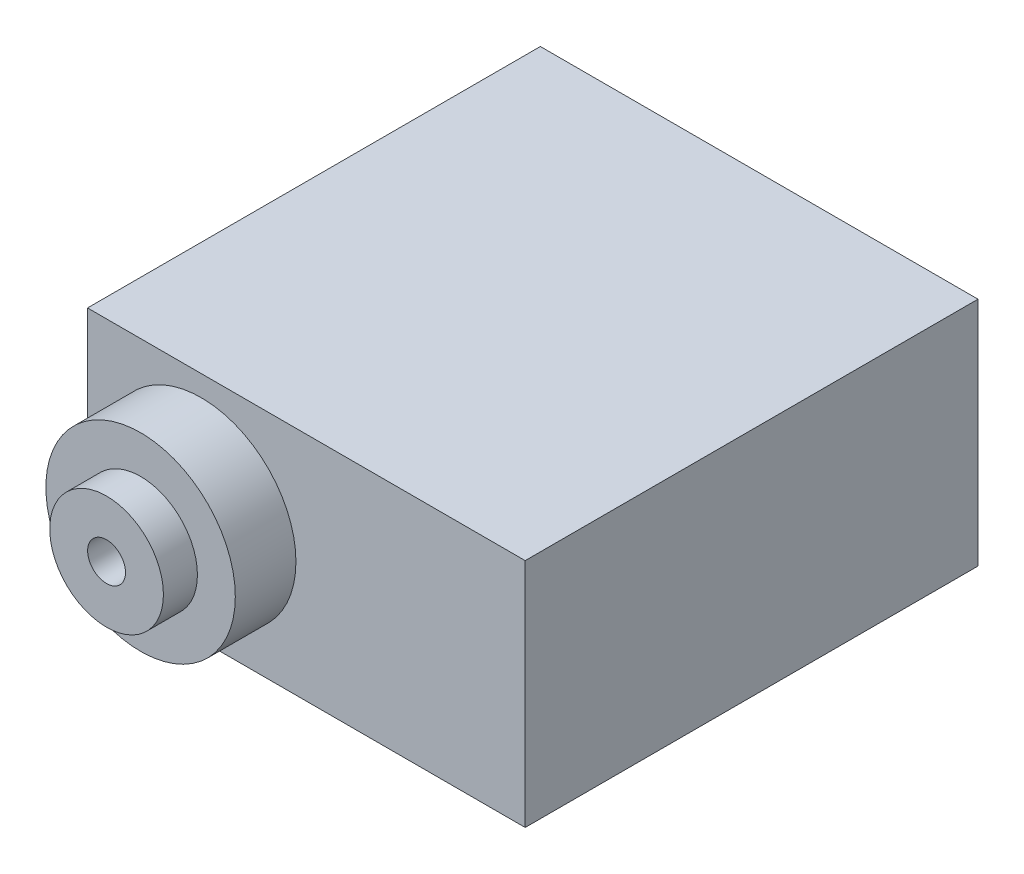
ISO-10303-21;
HEADER;
FILE_DESCRIPTION(('STEP AP214'),'2;1');
FILE_NAME('part.step','',(''),(''),'','','');
FILE_SCHEMA(('AUTOMOTIVE_DESIGN { 1 0 10303 214 1 1 1 1 }'));
ENDSEC;
DATA;
#1=APPLICATION_CONTEXT('core data for automotive mechanical design processes');
#2=APPLICATION_PROTOCOL_DEFINITION('international standard','automotive_design',2000,#1);
#3=PRODUCT_CONTEXT('',#1,'mechanical');
#4=PRODUCT('Part','Part','',(#3));
#5=PRODUCT_RELATED_PRODUCT_CATEGORY('part','',(#4));
#6=PRODUCT_DEFINITION_FORMATION('','',#4);
#7=PRODUCT_DEFINITION_CONTEXT('part definition',#1,'design');
#8=PRODUCT_DEFINITION('design','',#6,#7);
#9=PRODUCT_DEFINITION_SHAPE('','',#8);
#10=(LENGTH_UNIT() NAMED_UNIT(*) SI_UNIT(.MILLI.,.METRE.));
#11=(NAMED_UNIT(*) PLANE_ANGLE_UNIT() SI_UNIT($,.RADIAN.));
#12=(NAMED_UNIT(*) SI_UNIT($,.STERADIAN.) SOLID_ANGLE_UNIT());
#13=UNCERTAINTY_MEASURE_WITH_UNIT(LENGTH_MEASURE(1.E-05),#10,'distance_accuracy_value','');
#14=(GEOMETRIC_REPRESENTATION_CONTEXT(3) GLOBAL_UNCERTAINTY_ASSIGNED_CONTEXT((#13)) GLOBAL_UNIT_ASSIGNED_CONTEXT((#10,
#11,#12)) REPRESENTATION_CONTEXT('',''));
#15=CARTESIAN_POINT('',(0.,0.,0.));
#16=DIRECTION('',(0.,0.,1.));
#17=DIRECTION('',(1.,0.,0.));
#18=AXIS2_PLACEMENT_3D('',#15,#16,#17);
#19=CARTESIAN_POINT('',(-11.8102114397208,3.06527439201778,-27.1));
#20=DIRECTION('',(-1.,0.,0.));
#21=DIRECTION('',(0.,-1.,0.));
#22=AXIS2_PLACEMENT_3D('',#19,#20,#21);
#23=PLANE('',#22);
#24=DIRECTION('',(0.,0.,1.));
#25=VECTOR('',#24,1.);
#26=CARTESIAN_POINT('',(-11.8102114397208,3.06527439201778,-27.1));
#27=LINE('',#26,#25);
#28=CARTESIAN_POINT('',(-11.8102114397208,3.06527439201778,-23.9));
#29=VERTEX_POINT('',#28);
#30=CARTESIAN_POINT('',(-11.8102114397208,3.06527439201778,0.));
#31=VERTEX_POINT('',#30);
#32=EDGE_CURVE('E11',#29,#31,#27,.T.);
#33=ORIENTED_EDGE('',*,*,#32,.F.);
#34=DIRECTION('',(0.,1.,0.));
#35=VECTOR('',#34,1.);
#36=CARTESIAN_POINT('',(-11.8102114397208,-9.13472560798222,-23.9));
#37=LINE('',#36,#35);
#38=CARTESIAN_POINT('',(-11.8102114397208,-9.13472560798222,-23.9));
#39=VERTEX_POINT('',#38);
#40=EDGE_CURVE('E78',#39,#29,#37,.T.);
#41=ORIENTED_EDGE('',*,*,#40,.F.);
#42=DIRECTION('',(0.,0.,1.));
#43=VECTOR('',#42,1.);
#44=CARTESIAN_POINT('',(-11.8102114397208,-9.13472560798222,-27.1));
#45=LINE('',#44,#43);
#46=CARTESIAN_POINT('',(-11.8102114397208,-9.13472560798222,0.));
#47=VERTEX_POINT('',#46);
#48=EDGE_CURVE('E39',#39,#47,#45,.T.);
#49=ORIENTED_EDGE('',*,*,#48,.T.);
#50=DIRECTION('',(0.,-1.,0.));
#51=VECTOR('',#50,1.);
#52=CARTESIAN_POINT('',(-11.8102114397208,3.06527439201778,0.));
#53=LINE('',#52,#51);
#54=EDGE_CURVE('E135',#31,#47,#53,.T.);
#55=ORIENTED_EDGE('',*,*,#54,.F.);
#56=EDGE_LOOP('',(#33,#41,#49,#55));
#57=FACE_BOUND('',#56,.T.);
#58=ADVANCED_FACE('F36',(#57),#23,.T.);
#59=CARTESIAN_POINT('',(-11.8102114397208,3.06527439201778,-27.1));
#60=DIRECTION('',(0.,1.,0.));
#61=DIRECTION('',(0.,0.,1.));
#62=AXIS2_PLACEMENT_3D('',#59,#60,#61);
#63=PLANE('',#62);
#64=DIRECTION('',(0.,0.,1.));
#65=VECTOR('',#64,1.);
#66=CARTESIAN_POINT('',(11.2897885602792,3.06527439201778,-27.1));
#67=LINE('',#66,#65);
#68=CARTESIAN_POINT('',(11.2897885602792,3.06527439201778,-23.9));
#69=VERTEX_POINT('',#68);
#70=CARTESIAN_POINT('',(11.2897885602792,3.06527439201778,0.));
#71=VERTEX_POINT('',#70);
#72=EDGE_CURVE('E44',#69,#71,#67,.T.);
#73=ORIENTED_EDGE('',*,*,#72,.F.);
#74=DIRECTION('',(1.,0.,0.));
#75=VECTOR('',#74,1.);
#76=CARTESIAN_POINT('',(-11.8102114397208,3.06527439201778,-23.9));
#77=LINE('',#76,#75);
#78=EDGE_CURVE('E86',#29,#69,#77,.T.);
#79=ORIENTED_EDGE('',*,*,#78,.F.);
#80=ORIENTED_EDGE('',*,*,#32,.T.);
#81=DIRECTION('',(-1.,0.,0.));
#82=VECTOR('',#81,1.);
#83=CARTESIAN_POINT('',(-11.8102114397208,3.06527439201778,0.));
#84=LINE('',#83,#82);
#85=EDGE_CURVE('E93',#71,#31,#84,.T.);
#86=ORIENTED_EDGE('',*,*,#85,.F.);
#87=EDGE_LOOP('',(#73,#79,#80,#86));
#88=FACE_BOUND('',#87,.T.);
#89=ADVANCED_FACE('F107',(#88),#63,.T.);
#90=CARTESIAN_POINT('',(11.2897885602792,3.06527439201778,-27.1));
#91=DIRECTION('',(1.,0.,0.));
#92=DIRECTION('',(0.,1.,0.));
#93=AXIS2_PLACEMENT_3D('',#90,#91,#92);
#94=PLANE('',#93);
#95=DIRECTION('',(0.,0.,1.));
#96=VECTOR('',#95,1.);
#97=CARTESIAN_POINT('',(11.2897885602792,-9.13472560798222,-27.1));
#98=LINE('',#97,#96);
#99=CARTESIAN_POINT('',(11.2897885602792,-9.13472560798222,-23.9));
#100=VERTEX_POINT('',#99);
#101=CARTESIAN_POINT('',(11.2897885602792,-9.13472560798222,0.));
#102=VERTEX_POINT('',#101);
#103=EDGE_CURVE('E92',#100,#102,#98,.T.);
#104=ORIENTED_EDGE('',*,*,#103,.F.);
#105=DIRECTION('',(0.,-1.,0.));
#106=VECTOR('',#105,1.);
#107=CARTESIAN_POINT('',(11.2897885602792,3.06527439201778,-23.9));
#108=LINE('',#107,#106);
#109=EDGE_CURVE('E52',#69,#100,#108,.T.);
#110=ORIENTED_EDGE('',*,*,#109,.F.);
#111=ORIENTED_EDGE('',*,*,#72,.T.);
#112=DIRECTION('',(0.,1.,0.));
#113=VECTOR('',#112,1.);
#114=CARTESIAN_POINT('',(11.2897885602792,3.06527439201778,0.));
#115=LINE('',#114,#113);
#116=EDGE_CURVE('E95',#102,#71,#115,.T.);
#117=ORIENTED_EDGE('',*,*,#116,.F.);
#118=EDGE_LOOP('',(#104,#110,#111,#117));
#119=FACE_BOUND('',#118,.T.);
#120=ADVANCED_FACE('F105',(#119),#94,.T.);
#121=CARTESIAN_POINT('',(-11.8102114397208,-9.13472560798222,-27.1));
#122=DIRECTION('',(0.,-1.,0.));
#123=DIRECTION('',(0.,0.,-1.));
#124=AXIS2_PLACEMENT_3D('',#121,#122,#123);
#125=PLANE('',#124);
#126=ORIENTED_EDGE('',*,*,#48,.F.);
#127=DIRECTION('',(-1.,0.,0.));
#128=VECTOR('',#127,1.);
#129=CARTESIAN_POINT('',(11.2897885602792,-9.13472560798222,-23.9));
#130=LINE('',#129,#128);
#131=EDGE_CURVE('E75',#100,#39,#130,.T.);
#132=ORIENTED_EDGE('',*,*,#131,.F.);
#133=ORIENTED_EDGE('',*,*,#103,.T.);
#134=DIRECTION('',(1.,0.,0.));
#135=VECTOR('',#134,1.);
#136=CARTESIAN_POINT('',(-11.8102114397208,-9.13472560798222,0.));
#137=LINE('',#136,#135);
#138=EDGE_CURVE('E90',#47,#102,#137,.T.);
#139=ORIENTED_EDGE('',*,*,#138,.F.);
#140=EDGE_LOOP('',(#126,#132,#133,#139));
#141=FACE_BOUND('',#140,.T.);
#142=ADVANCED_FACE('F88',(#141),#125,.T.);
#143=CARTESIAN_POINT('',(0.,0.,0.));
#144=DIRECTION('',(0.,0.,1.));
#145=DIRECTION('',(1.,0.,0.));
#146=AXIS2_PLACEMENT_3D('',#143,#144,#145);
#147=PLANE('',#146);
#148=CARTESIAN_POINT('',(-5.81021143972075,-3.03472560798222,0.));
#149=DIRECTION('',(0.,0.,1.));
#150=DIRECTION('',(1.,0.,0.));
#151=AXIS2_PLACEMENT_3D('',#148,#149,#150);
#152=CIRCLE('',#151,5.);
#153=CARTESIAN_POINT('',(-0.810211439720754,-3.03472560798222,0.));
#154=VERTEX_POINT('',#153);
#155=EDGE_CURVE('E130',#154,#154,#152,.T.);
#156=ORIENTED_EDGE('',*,*,#155,.F.);
#157=EDGE_LOOP('',(#156));
#158=FACE_BOUND('',#157,.T.);
#159=ORIENTED_EDGE('',*,*,#54,.T.);
#160=ORIENTED_EDGE('',*,*,#138,.T.);
#161=ORIENTED_EDGE('',*,*,#116,.T.);
#162=ORIENTED_EDGE('',*,*,#85,.T.);
#163=EDGE_LOOP('',(#159,#160,#161,#162));
#164=FACE_BOUND('',#163,.T.);
#165=ADVANCED_FACE('F106',(#158,#164),#147,.T.);
#166=CARTESIAN_POINT('',(-5.81021143972075,-3.03472560798222,3.2));
#167=DIRECTION('',(0.,0.,-1.));
#168=DIRECTION('',(-1.,0.,0.));
#169=AXIS2_PLACEMENT_3D('',#166,#167,#168);
#170=CYLINDRICAL_SURFACE('',#169,5.);
#171=CARTESIAN_POINT('',(-5.81021143972075,-3.03472560798222,3.2));
#172=DIRECTION('',(0.,0.,1.));
#173=DIRECTION('',(1.,0.,0.));
#174=AXIS2_PLACEMENT_3D('',#171,#172,#173);
#175=CIRCLE('',#174,5.);
#176=CARTESIAN_POINT('',(-0.810211439720754,-3.03472560798222,3.2));
#177=VERTEX_POINT('',#176);
#178=EDGE_CURVE('E132',#177,#177,#175,.T.);
#179=ORIENTED_EDGE('',*,*,#178,.F.);
#180=EDGE_LOOP('',(#179));
#181=FACE_BOUND('',#180,.T.);
#182=ORIENTED_EDGE('',*,*,#155,.T.);
#183=EDGE_LOOP('',(#182));
#184=FACE_BOUND('',#183,.T.);
#185=ADVANCED_FACE('F121',(#181,#184),#170,.T.);
#186=CARTESIAN_POINT('',(-5.81021143972075,-3.03472560798222,3.2));
#187=DIRECTION('',(0.,0.,1.));
#188=DIRECTION('',(1.,0.,0.));
#189=AXIS2_PLACEMENT_3D('',#186,#187,#188);
#190=PLANE('',#189);
#191=CARTESIAN_POINT('',(-5.81021143972075,-3.03472560798222,3.2));
#192=DIRECTION('',(0.,0.,1.));
#193=DIRECTION('',(1.,0.,0.));
#194=AXIS2_PLACEMENT_3D('',#191,#192,#193);
#195=CIRCLE('',#194,3.);
#196=CARTESIAN_POINT('',(-2.81021143972075,-3.03472560798222,3.2));
#197=VERTEX_POINT('',#196);
#198=EDGE_CURVE('E82',#197,#197,#195,.T.);
#199=ORIENTED_EDGE('',*,*,#198,.F.);
#200=EDGE_LOOP('',(#199));
#201=FACE_BOUND('',#200,.T.);
#202=ORIENTED_EDGE('',*,*,#178,.T.);
#203=EDGE_LOOP('',(#202));
#204=FACE_BOUND('',#203,.T.);
#205=ADVANCED_FACE('F126',(#201,#204),#190,.T.);
#206=CARTESIAN_POINT('',(0.,0.,-23.9));
#207=DIRECTION('',(0.,0.,-1.));
#208=DIRECTION('',(-1.,0.,0.));
#209=AXIS2_PLACEMENT_3D('',#206,#207,#208);
#210=PLANE('',#209);
#211=ORIENTED_EDGE('',*,*,#131,.T.);
#212=ORIENTED_EDGE('',*,*,#40,.T.);
#213=ORIENTED_EDGE('',*,*,#78,.T.);
#214=ORIENTED_EDGE('',*,*,#109,.T.);
#215=EDGE_LOOP('',(#211,#212,#213,#214));
#216=FACE_BOUND('',#215,.T.);
#217=ADVANCED_FACE('F77',(#216),#210,.T.);
#218=CARTESIAN_POINT('',(-5.81021143972075,-3.03472560798222,4.99544443264667));
#219=DIRECTION('',(0.,0.,-1.));
#220=DIRECTION('',(-1.,0.,0.));
#221=AXIS2_PLACEMENT_3D('',#218,#219,#220);
#222=CYLINDRICAL_SURFACE('',#221,3.);
#223=ORIENTED_EDGE('',*,*,#198,.T.);
#224=EDGE_LOOP('',(#223));
#225=FACE_BOUND('',#224,.T.);
#226=CARTESIAN_POINT('',(-5.81021143972075,-3.03472560798222,4.99544443264667));
#227=DIRECTION('',(0.,0.,1.));
#228=DIRECTION('',(1.,0.,0.));
#229=AXIS2_PLACEMENT_3D('',#226,#227,#228);
#230=CIRCLE('',#229,3.);
#231=CARTESIAN_POINT('',(-2.81021143972075,-3.03472560798222,4.99544443264667));
#232=VERTEX_POINT('',#231);
#233=EDGE_CURVE('E143',#232,#232,#230,.T.);
#234=ORIENTED_EDGE('',*,*,#233,.F.);
#235=EDGE_LOOP('',(#234));
#236=FACE_BOUND('',#235,.T.);
#237=ADVANCED_FACE('F164',(#225,#236),#222,.T.);
#238=CARTESIAN_POINT('',(-5.81021143972075,-3.03472560798222,4.99544443264667));
#239=DIRECTION('',(0.,0.,1.));
#240=DIRECTION('',(1.,0.,0.));
#241=AXIS2_PLACEMENT_3D('',#238,#239,#240);
#242=PLANE('',#241);
#243=CARTESIAN_POINT('',(-5.81021143972075,-3.03472560798222,4.99544443264667));
#244=DIRECTION('',(0.,0.,1.));
#245=DIRECTION('',(1.,0.,0.));
#246=AXIS2_PLACEMENT_3D('',#243,#244,#245);
#247=CIRCLE('',#246,1.);
#248=CARTESIAN_POINT('',(-4.81021143972075,-3.03472560798222,4.99544443264667));
#249=VERTEX_POINT('',#248);
#250=EDGE_CURVE('E147',#249,#249,#247,.T.);
#251=ORIENTED_EDGE('',*,*,#250,.F.);
#252=EDGE_LOOP('',(#251));
#253=FACE_BOUND('',#252,.T.);
#254=ORIENTED_EDGE('',*,*,#233,.T.);
#255=EDGE_LOOP('',(#254));
#256=FACE_BOUND('',#255,.T.);
#257=ADVANCED_FACE('F158',(#253,#256),#242,.T.);
#258=CARTESIAN_POINT('',(-5.81021143972075,-3.03472560798222,-0.00455556735333429));
#259=DIRECTION('',(0.,0.,1.));
#260=DIRECTION('',(1.,0.,0.));
#261=AXIS2_PLACEMENT_3D('',#258,#259,#260);
#262=CYLINDRICAL_SURFACE('',#261,1.);
#263=CARTESIAN_POINT('',(-5.81021143972075,-3.03472560798222,-0.00455556735333429));
#264=DIRECTION('',(0.,0.,1.));
#265=DIRECTION('',(1.,0.,0.));
#266=AXIS2_PLACEMENT_3D('',#263,#264,#265);
#267=CIRCLE('',#266,1.);
#268=CARTESIAN_POINT('',(-4.81021143972075,-3.03472560798222,-0.00455556735333429));
#269=VERTEX_POINT('',#268);
#270=EDGE_CURVE('E146',#269,#269,#267,.T.);
#271=ORIENTED_EDGE('',*,*,#270,.F.);
#272=EDGE_LOOP('',(#271));
#273=FACE_BOUND('',#272,.T.);
#274=ORIENTED_EDGE('',*,*,#250,.T.);
#275=EDGE_LOOP('',(#274));
#276=FACE_BOUND('',#275,.T.);
#277=ADVANCED_FACE('F155',(#273,#276),#262,.F.);
#278=CARTESIAN_POINT('',(-5.81021143972075,-3.03472560798222,-0.00455556735333429));
#279=DIRECTION('',(0.,0.,1.));
#280=DIRECTION('',(1.,0.,0.));
#281=AXIS2_PLACEMENT_3D('',#278,#279,#280);
#282=PLANE('',#281);
#283=ORIENTED_EDGE('',*,*,#270,.T.);
#284=EDGE_LOOP('',(#283));
#285=FACE_BOUND('',#284,.T.);
#286=ADVANCED_FACE('F153',(#285),#282,.T.);
#287=CLOSED_SHELL('',(#58,#89,#120,#142,#165,#185,#205,#217,#237,#257,#277,#286));
#288=MANIFOLD_SOLID_BREP('B2',#287);
#289=ADVANCED_BREP_SHAPE_REPRESENTATION('',(#18,#288),#14);
#290=SHAPE_DEFINITION_REPRESENTATION(#9,#289);
ENDSEC;
END-ISO-10303-21;
